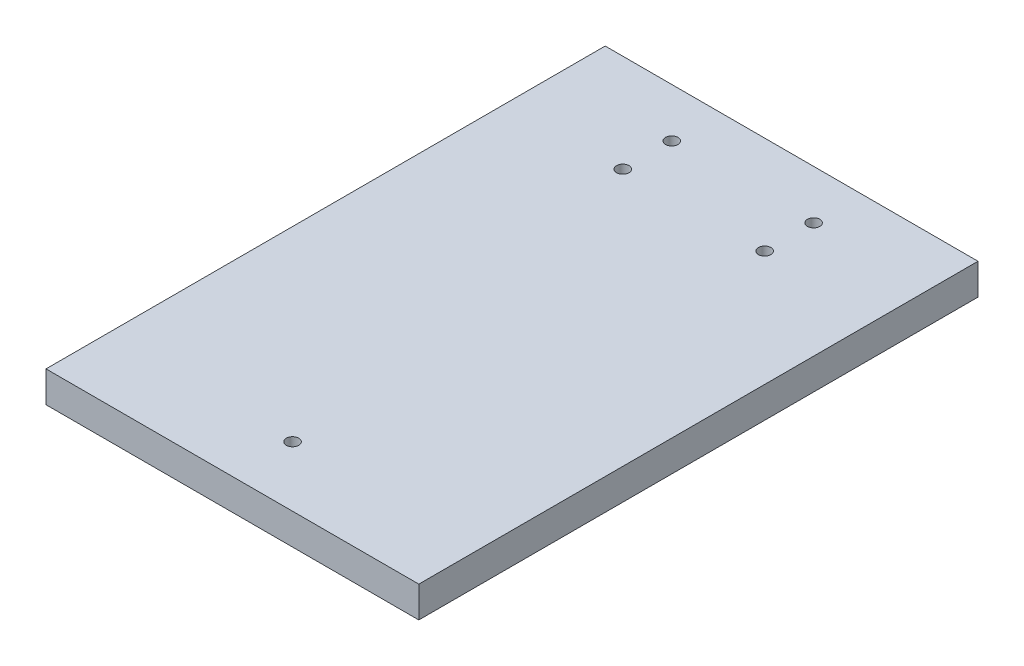
ISO-10303-21;
HEADER;
FILE_DESCRIPTION(('STEP AP214'),'2;1');
FILE_NAME('part.step','',(''),(''),'','','');
FILE_SCHEMA(('AUTOMOTIVE_DESIGN { 1 0 10303 214 1 1 1 1 }'));
ENDSEC;
DATA;
#1=APPLICATION_CONTEXT('core data for automotive mechanical design processes');
#2=APPLICATION_PROTOCOL_DEFINITION('international standard','automotive_design',2000,#1);
#3=PRODUCT_CONTEXT('',#1,'mechanical');
#4=PRODUCT('Part','Part','',(#3));
#5=PRODUCT_RELATED_PRODUCT_CATEGORY('part','',(#4));
#6=PRODUCT_DEFINITION_FORMATION('','',#4);
#7=PRODUCT_DEFINITION_CONTEXT('part definition',#1,'design');
#8=PRODUCT_DEFINITION('design','',#6,#7);
#9=PRODUCT_DEFINITION_SHAPE('','',#8);
#10=(LENGTH_UNIT() NAMED_UNIT(*) SI_UNIT(.MILLI.,.METRE.));
#11=(NAMED_UNIT(*) PLANE_ANGLE_UNIT() SI_UNIT($,.RADIAN.));
#12=(NAMED_UNIT(*) SI_UNIT($,.STERADIAN.) SOLID_ANGLE_UNIT());
#13=UNCERTAINTY_MEASURE_WITH_UNIT(LENGTH_MEASURE(1.E-05),#10,'distance_accuracy_value','');
#14=(GEOMETRIC_REPRESENTATION_CONTEXT(3) GLOBAL_UNCERTAINTY_ASSIGNED_CONTEXT((#13)) GLOBAL_UNIT_ASSIGNED_CONTEXT((#10,
#11,#12)) REPRESENTATION_CONTEXT('',''));
#15=CARTESIAN_POINT('',(0.,0.,0.));
#16=DIRECTION('',(0.,0.,1.));
#17=DIRECTION('',(1.,0.,0.));
#18=AXIS2_PLACEMENT_3D('',#15,#16,#17);
#19=CARTESIAN_POINT('',(0.,6.35,0.));
#20=DIRECTION('',(0.,-1.,0.));
#21=DIRECTION('',(0.,0.,-1.));
#22=AXIS2_PLACEMENT_3D('',#19,#20,#21);
#23=PLANE('',#22);
#24=DIRECTION('',(0.,0.,-1.));
#25=VECTOR('',#24,1.);
#26=CARTESIAN_POINT('',(38.1,6.35,57.15));
#27=LINE('',#26,#25);
#28=CARTESIAN_POINT('',(38.1,6.35,57.15));
#29=VERTEX_POINT('',#28);
#30=CARTESIAN_POINT('',(38.1,6.35,-57.15));
#31=VERTEX_POINT('',#30);
#32=EDGE_CURVE('E85',#29,#31,#27,.T.);
#33=ORIENTED_EDGE('',*,*,#32,.T.);
#34=DIRECTION('',(-1.,0.,0.));
#35=VECTOR('',#34,1.);
#36=CARTESIAN_POINT('',(-38.1,6.35,-57.15));
#37=LINE('',#36,#35);
#38=CARTESIAN_POINT('',(-38.1,6.35,-57.15));
#39=VERTEX_POINT('',#38);
#40=EDGE_CURVE('E80',#31,#39,#37,.T.);
#41=ORIENTED_EDGE('',*,*,#40,.T.);
#42=DIRECTION('',(0.,0.,1.));
#43=VECTOR('',#42,1.);
#44=CARTESIAN_POINT('',(-38.1,6.35,57.15));
#45=LINE('',#44,#43);
#46=CARTESIAN_POINT('',(-38.1,6.35,57.15));
#47=VERTEX_POINT('',#46);
#48=EDGE_CURVE('E83',#39,#47,#45,.T.);
#49=ORIENTED_EDGE('',*,*,#48,.T.);
#50=DIRECTION('',(1.,0.,0.));
#51=VECTOR('',#50,1.);
#52=CARTESIAN_POINT('',(-38.1,6.35,57.15));
#53=LINE('',#52,#51);
#54=EDGE_CURVE('E50',#47,#29,#53,.T.);
#55=ORIENTED_EDGE('',*,*,#54,.T.);
#56=EDGE_LOOP('',(#33,#41,#49,#55));
#57=FACE_BOUND('',#56,.T.);
#58=CARTESIAN_POINT('',(-14.5,6.35,-47.15));
#59=DIRECTION('',(0.,1.,0.));
#60=DIRECTION('',(0.,0.,1.));
#61=AXIS2_PLACEMENT_3D('',#58,#59,#60);
#62=CIRCLE('',#61,1.27);
#63=CARTESIAN_POINT('',(-14.5,6.35,-45.88));
#64=VERTEX_POINT('',#63);
#65=EDGE_CURVE('E100',#64,#64,#62,.T.);
#66=ORIENTED_EDGE('',*,*,#65,.F.);
#67=EDGE_LOOP('',(#66));
#68=FACE_BOUND('',#67,.T.);
#69=CARTESIAN_POINT('',(14.5,6.35,-47.15));
#70=DIRECTION('',(0.,1.,0.));
#71=DIRECTION('',(0.,0.,1.));
#72=AXIS2_PLACEMENT_3D('',#69,#70,#71);
#73=CIRCLE('',#72,1.27);
#74=CARTESIAN_POINT('',(14.5,6.35,-45.88));
#75=VERTEX_POINT('',#74);
#76=EDGE_CURVE('E115',#75,#75,#73,.T.);
#77=ORIENTED_EDGE('',*,*,#76,.F.);
#78=EDGE_LOOP('',(#77));
#79=FACE_BOUND('',#78,.T.);
#80=CARTESIAN_POINT('',(0.,6.35,44.85));
#81=DIRECTION('',(0.,1.,0.));
#82=DIRECTION('',(0.,0.,1.));
#83=AXIS2_PLACEMENT_3D('',#80,#81,#82);
#84=CIRCLE('',#83,1.27);
#85=CARTESIAN_POINT('',(0.,6.35,46.12));
#86=VERTEX_POINT('',#85);
#87=EDGE_CURVE('E121',#86,#86,#84,.T.);
#88=ORIENTED_EDGE('',*,*,#87,.F.);
#89=EDGE_LOOP('',(#88));
#90=FACE_BOUND('',#89,.T.);
#91=CARTESIAN_POINT('',(-14.5,6.35,-37.15));
#92=DIRECTION('',(0.,1.,0.));
#93=DIRECTION('',(0.,0.,1.));
#94=AXIS2_PLACEMENT_3D('',#91,#92,#93);
#95=CIRCLE('',#94,1.27);
#96=CARTESIAN_POINT('',(-14.5,6.35,-35.88));
#97=VERTEX_POINT('',#96);
#98=EDGE_CURVE('E127',#97,#97,#95,.T.);
#99=ORIENTED_EDGE('',*,*,#98,.F.);
#100=EDGE_LOOP('',(#99));
#101=FACE_BOUND('',#100,.T.);
#102=CARTESIAN_POINT('',(14.5,6.35,-37.15));
#103=DIRECTION('',(0.,1.,0.));
#104=DIRECTION('',(0.,0.,1.));
#105=AXIS2_PLACEMENT_3D('',#102,#103,#104);
#106=CIRCLE('',#105,1.27);
#107=CARTESIAN_POINT('',(14.5,6.35,-35.88));
#108=VERTEX_POINT('',#107);
#109=EDGE_CURVE('E133',#108,#108,#106,.T.);
#110=ORIENTED_EDGE('',*,*,#109,.F.);
#111=EDGE_LOOP('',(#110));
#112=FACE_BOUND('',#111,.T.);
#113=ADVANCED_FACE('F33',(#57,#68,#79,#90,#101,#112),#23,.F.);
#114=CARTESIAN_POINT('',(0.,0.,0.));
#115=DIRECTION('',(0.,-1.,0.));
#116=DIRECTION('',(0.,0.,-1.));
#117=AXIS2_PLACEMENT_3D('',#114,#115,#116);
#118=PLANE('',#117);
#119=CARTESIAN_POINT('',(-14.5,0.,-37.15));
#120=DIRECTION('',(0.,1.,0.));
#121=DIRECTION('',(0.,0.,1.));
#122=AXIS2_PLACEMENT_3D('',#119,#120,#121);
#123=CIRCLE('',#122,1.27);
#124=CARTESIAN_POINT('',(-14.5,0.,-35.88));
#125=VERTEX_POINT('',#124);
#126=EDGE_CURVE('E130',#125,#125,#123,.T.);
#127=ORIENTED_EDGE('',*,*,#126,.T.);
#128=EDGE_LOOP('',(#127));
#129=FACE_BOUND('',#128,.T.);
#130=CARTESIAN_POINT('',(14.5,0.,-47.15));
#131=DIRECTION('',(0.,1.,0.));
#132=DIRECTION('',(0.,0.,1.));
#133=AXIS2_PLACEMENT_3D('',#130,#131,#132);
#134=CIRCLE('',#133,1.27);
#135=CARTESIAN_POINT('',(14.5,0.,-45.88));
#136=VERTEX_POINT('',#135);
#137=EDGE_CURVE('E118',#136,#136,#134,.T.);
#138=ORIENTED_EDGE('',*,*,#137,.T.);
#139=EDGE_LOOP('',(#138));
#140=FACE_BOUND('',#139,.T.);
#141=DIRECTION('',(0.,0.,-1.));
#142=VECTOR('',#141,1.);
#143=CARTESIAN_POINT('',(38.1,0.,57.15));
#144=LINE('',#143,#142);
#145=CARTESIAN_POINT('',(38.1,0.,57.15));
#146=VERTEX_POINT('',#145);
#147=CARTESIAN_POINT('',(38.1,0.,-57.15));
#148=VERTEX_POINT('',#147);
#149=EDGE_CURVE('E97',#146,#148,#144,.T.);
#150=ORIENTED_EDGE('',*,*,#149,.F.);
#151=DIRECTION('',(1.,0.,0.));
#152=VECTOR('',#151,1.);
#153=CARTESIAN_POINT('',(-38.1,0.,57.15));
#154=LINE('',#153,#152);
#155=CARTESIAN_POINT('',(-38.1,0.,57.15));
#156=VERTEX_POINT('',#155);
#157=EDGE_CURVE('E73',#156,#146,#154,.T.);
#158=ORIENTED_EDGE('',*,*,#157,.F.);
#159=DIRECTION('',(0.,0.,1.));
#160=VECTOR('',#159,1.);
#161=CARTESIAN_POINT('',(-38.1,0.,57.15));
#162=LINE('',#161,#160);
#163=CARTESIAN_POINT('',(-38.1,0.,-57.15));
#164=VERTEX_POINT('',#163);
#165=EDGE_CURVE('E67',#164,#156,#162,.T.);
#166=ORIENTED_EDGE('',*,*,#165,.F.);
#167=DIRECTION('',(-1.,0.,0.));
#168=VECTOR('',#167,1.);
#169=CARTESIAN_POINT('',(-38.1,0.,-57.15));
#170=LINE('',#169,#168);
#171=EDGE_CURVE('E89',#148,#164,#170,.T.);
#172=ORIENTED_EDGE('',*,*,#171,.F.);
#173=EDGE_LOOP('',(#150,#158,#166,#172));
#174=FACE_BOUND('',#173,.T.);
#175=CARTESIAN_POINT('',(-14.5,0.,-47.15));
#176=DIRECTION('',(0.,1.,0.));
#177=DIRECTION('',(0.,0.,1.));
#178=AXIS2_PLACEMENT_3D('',#175,#176,#177);
#179=CIRCLE('',#178,1.27);
#180=CARTESIAN_POINT('',(-14.5,0.,-45.88));
#181=VERTEX_POINT('',#180);
#182=EDGE_CURVE('E112',#181,#181,#179,.T.);
#183=ORIENTED_EDGE('',*,*,#182,.T.);
#184=EDGE_LOOP('',(#183));
#185=FACE_BOUND('',#184,.T.);
#186=CARTESIAN_POINT('',(0.,0.,44.85));
#187=DIRECTION('',(0.,1.,0.));
#188=DIRECTION('',(0.,0.,1.));
#189=AXIS2_PLACEMENT_3D('',#186,#187,#188);
#190=CIRCLE('',#189,1.27);
#191=CARTESIAN_POINT('',(0.,0.,46.12));
#192=VERTEX_POINT('',#191);
#193=EDGE_CURVE('E124',#192,#192,#190,.T.);
#194=ORIENTED_EDGE('',*,*,#193,.T.);
#195=EDGE_LOOP('',(#194));
#196=FACE_BOUND('',#195,.T.);
#197=CARTESIAN_POINT('',(14.5,0.,-37.15));
#198=DIRECTION('',(0.,1.,0.));
#199=DIRECTION('',(0.,0.,1.));
#200=AXIS2_PLACEMENT_3D('',#197,#198,#199);
#201=CIRCLE('',#200,1.27);
#202=CARTESIAN_POINT('',(14.5,0.,-35.88));
#203=VERTEX_POINT('',#202);
#204=EDGE_CURVE('E136',#203,#203,#201,.T.);
#205=ORIENTED_EDGE('',*,*,#204,.T.);
#206=EDGE_LOOP('',(#205));
#207=FACE_BOUND('',#206,.T.);
#208=ADVANCED_FACE('F108',(#129,#140,#174,#185,#196,#207),#118,.T.);
#209=CARTESIAN_POINT('',(38.1,6.35,57.15));
#210=DIRECTION('',(-1.,0.,0.));
#211=DIRECTION('',(0.,0.,1.));
#212=AXIS2_PLACEMENT_3D('',#209,#210,#211);
#213=PLANE('',#212);
#214=ORIENTED_EDGE('',*,*,#149,.T.);
#215=DIRECTION('',(0.,-1.,0.));
#216=VECTOR('',#215,1.);
#217=CARTESIAN_POINT('',(38.1,6.35,-57.15));
#218=LINE('',#217,#216);
#219=EDGE_CURVE('E11',#31,#148,#218,.T.);
#220=ORIENTED_EDGE('',*,*,#219,.F.);
#221=ORIENTED_EDGE('',*,*,#32,.F.);
#222=DIRECTION('',(0.,-1.,0.));
#223=VECTOR('',#222,1.);
#224=CARTESIAN_POINT('',(38.1,6.35,57.15));
#225=LINE('',#224,#223);
#226=EDGE_CURVE('E93',#29,#146,#225,.T.);
#227=ORIENTED_EDGE('',*,*,#226,.T.);
#228=EDGE_LOOP('',(#214,#220,#221,#227));
#229=FACE_BOUND('',#228,.T.);
#230=ADVANCED_FACE('F35',(#229),#213,.F.);
#231=CARTESIAN_POINT('',(-38.1,6.35,-57.15));
#232=DIRECTION('',(0.,0.,1.));
#233=DIRECTION('',(1.,0.,0.));
#234=AXIS2_PLACEMENT_3D('',#231,#232,#233);
#235=PLANE('',#234);
#236=ORIENTED_EDGE('',*,*,#171,.T.);
#237=DIRECTION('',(0.,-1.,0.));
#238=VECTOR('',#237,1.);
#239=CARTESIAN_POINT('',(-38.1,6.35,-57.15));
#240=LINE('',#239,#238);
#241=EDGE_CURVE('E42',#39,#164,#240,.T.);
#242=ORIENTED_EDGE('',*,*,#241,.F.);
#243=ORIENTED_EDGE('',*,*,#40,.F.);
#244=ORIENTED_EDGE('',*,*,#219,.T.);
#245=EDGE_LOOP('',(#236,#242,#243,#244));
#246=FACE_BOUND('',#245,.T.);
#247=ADVANCED_FACE('F88',(#246),#235,.F.);
#248=CARTESIAN_POINT('',(-38.1,6.35,57.15));
#249=DIRECTION('',(1.,0.,0.));
#250=DIRECTION('',(0.,0.,-1.));
#251=AXIS2_PLACEMENT_3D('',#248,#249,#250);
#252=PLANE('',#251);
#253=ORIENTED_EDGE('',*,*,#165,.T.);
#254=DIRECTION('',(0.,-1.,0.));
#255=VECTOR('',#254,1.);
#256=CARTESIAN_POINT('',(-38.1,6.35,57.15));
#257=LINE('',#256,#255);
#258=EDGE_CURVE('E90',#47,#156,#257,.T.);
#259=ORIENTED_EDGE('',*,*,#258,.F.);
#260=ORIENTED_EDGE('',*,*,#48,.F.);
#261=ORIENTED_EDGE('',*,*,#241,.T.);
#262=EDGE_LOOP('',(#253,#259,#260,#261));
#263=FACE_BOUND('',#262,.T.);
#264=ADVANCED_FACE('F91',(#263),#252,.F.);
#265=CARTESIAN_POINT('',(-38.1,6.35,57.15));
#266=DIRECTION('',(0.,0.,-1.));
#267=DIRECTION('',(-1.,0.,0.));
#268=AXIS2_PLACEMENT_3D('',#265,#266,#267);
#269=PLANE('',#268);
#270=ORIENTED_EDGE('',*,*,#157,.T.);
#271=ORIENTED_EDGE('',*,*,#226,.F.);
#272=ORIENTED_EDGE('',*,*,#54,.F.);
#273=ORIENTED_EDGE('',*,*,#258,.T.);
#274=EDGE_LOOP('',(#270,#271,#272,#273));
#275=FACE_BOUND('',#274,.T.);
#276=ADVANCED_FACE('F105',(#275),#269,.F.);
#277=CARTESIAN_POINT('',(-14.5,6.35,-47.15));
#278=DIRECTION('',(0.,-1.,0.));
#279=DIRECTION('',(0.,0.,-1.));
#280=AXIS2_PLACEMENT_3D('',#277,#278,#279);
#281=CYLINDRICAL_SURFACE('',#280,1.27);
#282=ORIENTED_EDGE('',*,*,#65,.T.);
#283=EDGE_LOOP('',(#282));
#284=FACE_BOUND('',#283,.T.);
#285=ORIENTED_EDGE('',*,*,#182,.F.);
#286=EDGE_LOOP('',(#285));
#287=FACE_BOUND('',#286,.T.);
#288=ADVANCED_FACE('F153',(#284,#287),#281,.F.);
#289=CARTESIAN_POINT('',(14.5,6.35,-47.15));
#290=DIRECTION('',(0.,-1.,0.));
#291=DIRECTION('',(0.,0.,-1.));
#292=AXIS2_PLACEMENT_3D('',#289,#290,#291);
#293=CYLINDRICAL_SURFACE('',#292,1.27);
#294=ORIENTED_EDGE('',*,*,#76,.T.);
#295=EDGE_LOOP('',(#294));
#296=FACE_BOUND('',#295,.T.);
#297=ORIENTED_EDGE('',*,*,#137,.F.);
#298=EDGE_LOOP('',(#297));
#299=FACE_BOUND('',#298,.T.);
#300=ADVANCED_FACE('F199',(#296,#299),#293,.F.);
#301=CARTESIAN_POINT('',(0.,6.35,44.85));
#302=DIRECTION('',(0.,-1.,0.));
#303=DIRECTION('',(0.,0.,-1.));
#304=AXIS2_PLACEMENT_3D('',#301,#302,#303);
#305=CYLINDRICAL_SURFACE('',#304,1.27);
#306=ORIENTED_EDGE('',*,*,#87,.T.);
#307=EDGE_LOOP('',(#306));
#308=FACE_BOUND('',#307,.T.);
#309=ORIENTED_EDGE('',*,*,#193,.F.);
#310=EDGE_LOOP('',(#309));
#311=FACE_BOUND('',#310,.T.);
#312=ADVANCED_FACE('F207',(#308,#311),#305,.F.);
#313=CARTESIAN_POINT('',(-14.5,6.35,-37.15));
#314=DIRECTION('',(0.,-1.,0.));
#315=DIRECTION('',(0.,0.,-1.));
#316=AXIS2_PLACEMENT_3D('',#313,#314,#315);
#317=CYLINDRICAL_SURFACE('',#316,1.27);
#318=ORIENTED_EDGE('',*,*,#98,.T.);
#319=EDGE_LOOP('',(#318));
#320=FACE_BOUND('',#319,.T.);
#321=ORIENTED_EDGE('',*,*,#126,.F.);
#322=EDGE_LOOP('',(#321));
#323=FACE_BOUND('',#322,.T.);
#324=ADVANCED_FACE('F215',(#320,#323),#317,.F.);
#325=CARTESIAN_POINT('',(14.5,6.35,-37.15));
#326=DIRECTION('',(0.,-1.,0.));
#327=DIRECTION('',(0.,0.,-1.));
#328=AXIS2_PLACEMENT_3D('',#325,#326,#327);
#329=CYLINDRICAL_SURFACE('',#328,1.27);
#330=ORIENTED_EDGE('',*,*,#109,.T.);
#331=EDGE_LOOP('',(#330));
#332=FACE_BOUND('',#331,.T.);
#333=ORIENTED_EDGE('',*,*,#204,.F.);
#334=EDGE_LOOP('',(#333));
#335=FACE_BOUND('',#334,.T.);
#336=ADVANCED_FACE('F142',(#332,#335),#329,.F.);
#337=CLOSED_SHELL('',(#113,#208,#230,#247,#264,#276,#288,#300,#312,#324,#336));
#338=MANIFOLD_SOLID_BREP('B2',#337);
#339=ADVANCED_BREP_SHAPE_REPRESENTATION('',(#18,#338),#14);
#340=SHAPE_DEFINITION_REPRESENTATION(#9,#339);
ENDSEC;
END-ISO-10303-21;
